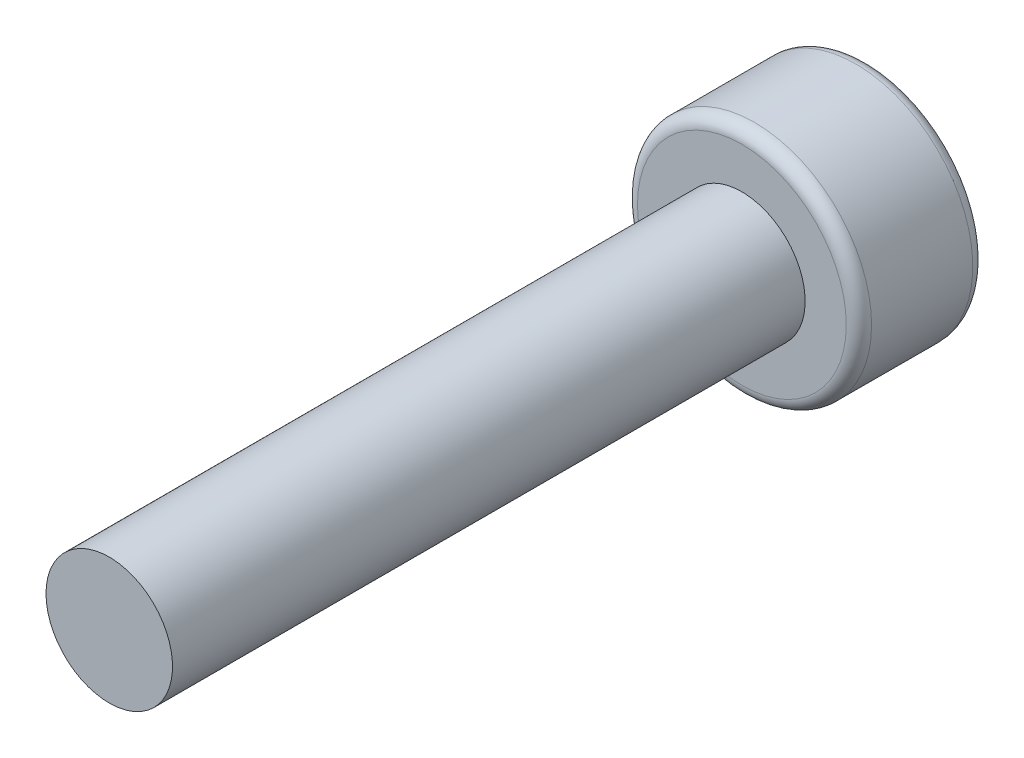
ISO-10303-21;
HEADER;
FILE_DESCRIPTION(('STEP AP214'),'2;1');
FILE_NAME('part.step','',(''),(''),'','','');
FILE_SCHEMA(('AUTOMOTIVE_DESIGN { 1 0 10303 214 1 1 1 1 }'));
ENDSEC;
DATA;
#1=APPLICATION_CONTEXT('core data for automotive mechanical design processes');
#2=APPLICATION_PROTOCOL_DEFINITION('international standard','automotive_design',2000,#1);
#3=PRODUCT_CONTEXT('',#1,'mechanical');
#4=PRODUCT('Part','Part','',(#3));
#5=PRODUCT_RELATED_PRODUCT_CATEGORY('part','',(#4));
#6=PRODUCT_DEFINITION_FORMATION('','',#4);
#7=PRODUCT_DEFINITION_CONTEXT('part definition',#1,'design');
#8=PRODUCT_DEFINITION('design','',#6,#7);
#9=PRODUCT_DEFINITION_SHAPE('','',#8);
#10=(LENGTH_UNIT() NAMED_UNIT(*) SI_UNIT(.MILLI.,.METRE.));
#11=(NAMED_UNIT(*) PLANE_ANGLE_UNIT() SI_UNIT($,.RADIAN.));
#12=(NAMED_UNIT(*) SI_UNIT($,.STERADIAN.) SOLID_ANGLE_UNIT());
#13=UNCERTAINTY_MEASURE_WITH_UNIT(LENGTH_MEASURE(1.E-05),#10,'distance_accuracy_value','');
#14=(GEOMETRIC_REPRESENTATION_CONTEXT(3) GLOBAL_UNCERTAINTY_ASSIGNED_CONTEXT((#13)) GLOBAL_UNIT_ASSIGNED_CONTEXT((#10,
#11,#12)) REPRESENTATION_CONTEXT('',''));
#15=CARTESIAN_POINT('',(0.,0.,0.));
#16=DIRECTION('',(0.,0.,1.));
#17=DIRECTION('',(1.,0.,0.));
#18=AXIS2_PLACEMENT_3D('',#15,#16,#17);
#19=CARTESIAN_POINT('',(0.,0.,1.));
#20=DIRECTION('',(0.,0.,-1.));
#21=DIRECTION('',(-1.,0.,0.));
#22=AXIS2_PLACEMENT_3D('',#19,#20,#21);
#23=PLANE('',#22);
#24=DIRECTION('',(0.698983626140259,-0.715137672331569,0.));
#25=VECTOR('',#24,1.);
#26=CARTESIAN_POINT('',(-0.380295932212079,-1.35708342933218,1.));
#27=LINE('',#26,#25);
#28=CARTESIAN_POINT('',(-0.380295932212079,-1.35708342933218,1.));
#29=VERTEX_POINT('',#28);
#30=CARTESIAN_POINT('',(-1.36541669096261,-0.349195776414544,1.));
#31=VERTEX_POINT('',#30);
#32=EDGE_CURVE('E104',#29,#31,#27,.F.);
#33=ORIENTED_EDGE('',*,*,#32,.T.);
#34=DIRECTION('',(-0.269835578372281,-0.962906413232614,0.));
#35=VECTOR('',#34,1.);
#36=CARTESIAN_POINT('',(-1.36541669096261,-0.349195776414544,1.));
#37=LINE('',#36,#35);
#38=CARTESIAN_POINT('',(-0.98512075875053,1.00788765291763,1.));
#39=VERTEX_POINT('',#38);
#40=EDGE_CURVE('E184',#31,#39,#37,.F.);
#41=ORIENTED_EDGE('',*,*,#40,.T.);
#42=DIRECTION('',(-0.96881920451254,-0.247768740901045,0.));
#43=VECTOR('',#42,1.);
#44=CARTESIAN_POINT('',(-0.98512075875053,1.00788765291763,1.));
#45=LINE('',#44,#43);
#46=CARTESIAN_POINT('',(0.380295932212079,1.35708342933218,1.));
#47=VERTEX_POINT('',#46);
#48=EDGE_CURVE('E179',#39,#47,#45,.F.);
#49=ORIENTED_EDGE('',*,*,#48,.T.);
#50=DIRECTION('',(-0.698983626140259,0.715137672331569,0.));
#51=VECTOR('',#50,1.);
#52=CARTESIAN_POINT('',(0.380295932212079,1.35708342933218,1.));
#53=LINE('',#52,#51);
#54=CARTESIAN_POINT('',(1.36541669096261,0.349195776414543,1.));
#55=VERTEX_POINT('',#54);
#56=EDGE_CURVE('E87',#47,#55,#53,.F.);
#57=ORIENTED_EDGE('',*,*,#56,.T.);
#58=DIRECTION('',(0.269835578372281,0.962906413232614,0.));
#59=VECTOR('',#58,1.);
#60=CARTESIAN_POINT('',(1.36541669096261,0.349195776414543,1.));
#61=LINE('',#60,#59);
#62=CARTESIAN_POINT('',(0.98512075875053,-1.00788765291763,1.));
#63=VERTEX_POINT('',#62);
#64=EDGE_CURVE('E84',#55,#63,#61,.F.);
#65=ORIENTED_EDGE('',*,*,#64,.T.);
#66=DIRECTION('',(0.96881920451254,0.247768740901045,0.));
#67=VECTOR('',#66,1.);
#68=CARTESIAN_POINT('',(0.98512075875053,-1.00788765291763,1.));
#69=LINE('',#68,#67);
#70=EDGE_CURVE('E81',#63,#29,#69,.F.);
#71=ORIENTED_EDGE('',*,*,#70,.T.);
#72=EDGE_LOOP('',(#33,#41,#49,#57,#65,#71));
#73=FACE_BOUND('',#72,.T.);
#74=ADVANCED_FACE('F17',(#73),#23,.T.);
#75=CARTESIAN_POINT('',(1.36541669096261,0.349195776414543,1.));
#76=DIRECTION('',(0.962906413232614,-0.269835578372281,0.));
#77=DIRECTION('',(0.269835578372281,0.962906413232614,0.));
#78=AXIS2_PLACEMENT_3D('',#75,#76,#77);
#79=PLANE('',#78);
#80=DIRECTION('',(0.,0.,1.));
#81=VECTOR('',#80,1.);
#82=CARTESIAN_POINT('',(0.98512075875053,-1.00788765291763,1.));
#83=LINE('',#82,#81);
#84=CARTESIAN_POINT('',(0.98512075875053,-1.00788765291763,0.));
#85=VERTEX_POINT('',#84);
#86=EDGE_CURVE('E90',#85,#63,#83,.T.);
#87=ORIENTED_EDGE('',*,*,#86,.T.);
#88=ORIENTED_EDGE('',*,*,#64,.F.);
#89=DIRECTION('',(0.,0.,1.));
#90=VECTOR('',#89,1.);
#91=CARTESIAN_POINT('',(1.36541669096261,0.349195776414543,1.));
#92=LINE('',#91,#90);
#93=CARTESIAN_POINT('',(1.36541669096261,0.349195776414543,0.));
#94=VERTEX_POINT('',#93);
#95=EDGE_CURVE('E168',#55,#94,#92,.F.);
#96=ORIENTED_EDGE('',*,*,#95,.T.);
#97=DIRECTION('',(-0.269835578372281,-0.962906413232614,0.));
#98=VECTOR('',#97,1.);
#99=CARTESIAN_POINT('',(1.36541669096261,0.349195776414543,0.));
#100=LINE('',#99,#98);
#101=EDGE_CURVE('E95',#94,#85,#100,.T.);
#102=ORIENTED_EDGE('',*,*,#101,.T.);
#103=EDGE_LOOP('',(#87,#88,#96,#102));
#104=FACE_BOUND('',#103,.T.);
#105=ADVANCED_FACE('F93',(#104),#79,.F.);
#106=CARTESIAN_POINT('',(0.98512075875053,-1.00788765291763,1.));
#107=DIRECTION('',(0.247768740901045,-0.96881920451254,0.));
#108=DIRECTION('',(0.96881920451254,0.247768740901045,0.));
#109=AXIS2_PLACEMENT_3D('',#106,#107,#108);
#110=PLANE('',#109);
#111=DIRECTION('',(0.,0.,1.));
#112=VECTOR('',#111,1.);
#113=CARTESIAN_POINT('',(-0.380295932212079,-1.35708342933218,1.));
#114=LINE('',#113,#112);
#115=CARTESIAN_POINT('',(-0.380295932212079,-1.35708342933218,0.));
#116=VERTEX_POINT('',#115);
#117=EDGE_CURVE('E101',#116,#29,#114,.T.);
#118=ORIENTED_EDGE('',*,*,#117,.T.);
#119=ORIENTED_EDGE('',*,*,#70,.F.);
#120=ORIENTED_EDGE('',*,*,#86,.F.);
#121=DIRECTION('',(-0.96881920451254,-0.247768740901045,0.));
#122=VECTOR('',#121,1.);
#123=CARTESIAN_POINT('',(0.98512075875053,-1.00788765291763,0.));
#124=LINE('',#123,#122);
#125=EDGE_CURVE('E213',#85,#116,#124,.T.);
#126=ORIENTED_EDGE('',*,*,#125,.T.);
#127=EDGE_LOOP('',(#118,#119,#120,#126));
#128=FACE_BOUND('',#127,.T.);
#129=ADVANCED_FACE('F99',(#128),#110,.F.);
#130=CARTESIAN_POINT('',(-0.380295932212079,-1.35708342933218,1.));
#131=DIRECTION('',(-0.715137672331569,-0.698983626140259,0.));
#132=DIRECTION('',(0.698983626140259,-0.715137672331569,0.));
#133=AXIS2_PLACEMENT_3D('',#130,#131,#132);
#134=PLANE('',#133);
#135=DIRECTION('',(0.,0.,1.));
#136=VECTOR('',#135,1.);
#137=CARTESIAN_POINT('',(-1.36541669096261,-0.349195776414544,1.));
#138=LINE('',#137,#136);
#139=CARTESIAN_POINT('',(-1.36541669096261,-0.349195776414544,0.));
#140=VERTEX_POINT('',#139);
#141=EDGE_CURVE('E186',#140,#31,#138,.T.);
#142=ORIENTED_EDGE('',*,*,#141,.T.);
#143=ORIENTED_EDGE('',*,*,#32,.F.);
#144=ORIENTED_EDGE('',*,*,#117,.F.);
#145=DIRECTION('',(-0.698983626140259,0.715137672331569,0.));
#146=VECTOR('',#145,1.);
#147=CARTESIAN_POINT('',(-0.380295932212079,-1.35708342933218,0.));
#148=LINE('',#147,#146);
#149=EDGE_CURVE('E193',#116,#140,#148,.T.);
#150=ORIENTED_EDGE('',*,*,#149,.T.);
#151=EDGE_LOOP('',(#142,#143,#144,#150));
#152=FACE_BOUND('',#151,.T.);
#153=ADVANCED_FACE('F191',(#152),#134,.F.);
#154=CARTESIAN_POINT('',(-1.36541669096261,-0.349195776414544,1.));
#155=DIRECTION('',(-0.962906413232614,0.269835578372281,0.));
#156=DIRECTION('',(-0.269835578372281,-0.962906413232614,0.));
#157=AXIS2_PLACEMENT_3D('',#154,#155,#156);
#158=PLANE('',#157);
#159=DIRECTION('',(0.,0.,1.));
#160=VECTOR('',#159,1.);
#161=CARTESIAN_POINT('',(-0.98512075875053,1.00788765291763,1.));
#162=LINE('',#161,#160);
#163=CARTESIAN_POINT('',(-0.98512075875053,1.00788765291763,0.));
#164=VERTEX_POINT('',#163);
#165=EDGE_CURVE('E181',#164,#39,#162,.T.);
#166=ORIENTED_EDGE('',*,*,#165,.T.);
#167=ORIENTED_EDGE('',*,*,#40,.F.);
#168=ORIENTED_EDGE('',*,*,#141,.F.);
#169=DIRECTION('',(0.26983557837228,0.962906413232614,0.));
#170=VECTOR('',#169,1.);
#171=CARTESIAN_POINT('',(-1.36541669096261,-0.349195776414544,0.));
#172=LINE('',#171,#170);
#173=EDGE_CURVE('E199',#140,#164,#172,.T.);
#174=ORIENTED_EDGE('',*,*,#173,.T.);
#175=EDGE_LOOP('',(#166,#167,#168,#174));
#176=FACE_BOUND('',#175,.T.);
#177=ADVANCED_FACE('F196',(#176),#158,.F.);
#178=CARTESIAN_POINT('',(-0.98512075875053,1.00788765291763,1.));
#179=DIRECTION('',(-0.247768740901045,0.96881920451254,0.));
#180=DIRECTION('',(-0.96881920451254,-0.247768740901045,0.));
#181=AXIS2_PLACEMENT_3D('',#178,#179,#180);
#182=PLANE('',#181);
#183=DIRECTION('',(0.,0.,1.));
#184=VECTOR('',#183,1.);
#185=CARTESIAN_POINT('',(0.380295932212079,1.35708342933218,1.));
#186=LINE('',#185,#184);
#187=CARTESIAN_POINT('',(0.380295932212079,1.35708342933218,0.));
#188=VERTEX_POINT('',#187);
#189=EDGE_CURVE('E176',#188,#47,#186,.T.);
#190=ORIENTED_EDGE('',*,*,#189,.T.);
#191=ORIENTED_EDGE('',*,*,#48,.F.);
#192=ORIENTED_EDGE('',*,*,#165,.F.);
#193=DIRECTION('',(0.96881920451254,0.247768740901045,0.));
#194=VECTOR('',#193,1.);
#195=CARTESIAN_POINT('',(-0.98512075875053,1.00788765291763,0.));
#196=LINE('',#195,#194);
#197=EDGE_CURVE('E204',#164,#188,#196,.T.);
#198=ORIENTED_EDGE('',*,*,#197,.T.);
#199=EDGE_LOOP('',(#190,#191,#192,#198));
#200=FACE_BOUND('',#199,.T.);
#201=ADVANCED_FACE('F202',(#200),#182,.F.);
#202=CARTESIAN_POINT('',(0.380295932212079,1.35708342933218,1.));
#203=DIRECTION('',(0.715137672331569,0.698983626140259,0.));
#204=DIRECTION('',(-0.698983626140259,0.715137672331569,0.));
#205=AXIS2_PLACEMENT_3D('',#202,#203,#204);
#206=PLANE('',#205);
#207=ORIENTED_EDGE('',*,*,#95,.F.);
#208=ORIENTED_EDGE('',*,*,#56,.F.);
#209=ORIENTED_EDGE('',*,*,#189,.F.);
#210=DIRECTION('',(0.698983626140259,-0.715137672331569,0.));
#211=VECTOR('',#210,1.);
#212=CARTESIAN_POINT('',(0.380295932212079,1.35708342933218,0.));
#213=LINE('',#212,#211);
#214=EDGE_CURVE('E209',#188,#94,#213,.T.);
#215=ORIENTED_EDGE('',*,*,#214,.T.);
#216=EDGE_LOOP('',(#207,#208,#209,#215));
#217=FACE_BOUND('',#216,.T.);
#218=ADVANCED_FACE('F208',(#217),#206,.F.);
#219=CARTESIAN_POINT('',(0.,0.,0.));
#220=DIRECTION('',(0.,0.,1.));
#221=DIRECTION('',(1.,0.,0.));
#222=AXIS2_PLACEMENT_3D('',#219,#220,#221);
#223=PLANE('',#222);
#224=CARTESIAN_POINT('',(0.,0.,0.));
#225=DIRECTION('',(0.,0.,1.));
#226=DIRECTION('',(1.,0.,0.));
#227=AXIS2_PLACEMENT_3D('',#224,#225,#226);
#228=CIRCLE('',#227,1.65);
#229=CARTESIAN_POINT('',(1.65,0.,0.));
#230=VERTEX_POINT('',#229);
#231=CARTESIAN_POINT('',(-1.65,0.,0.));
#232=VERTEX_POINT('',#231);
#233=EDGE_CURVE('E211',#230,#232,#228,.T.);
#234=ORIENTED_EDGE('',*,*,#233,.F.);
#235=CARTESIAN_POINT('',(0.,0.,0.));
#236=DIRECTION('',(0.,0.,1.));
#237=DIRECTION('',(-1.,0.,0.));
#238=AXIS2_PLACEMENT_3D('',#235,#236,#237);
#239=CIRCLE('',#238,1.65);
#240=EDGE_CURVE('E230',#232,#230,#239,.T.);
#241=ORIENTED_EDGE('',*,*,#240,.F.);
#242=EDGE_LOOP('',(#234,#241));
#243=FACE_BOUND('',#242,.T.);
#244=ORIENTED_EDGE('',*,*,#197,.F.);
#245=ORIENTED_EDGE('',*,*,#173,.F.);
#246=ORIENTED_EDGE('',*,*,#149,.F.);
#247=ORIENTED_EDGE('',*,*,#125,.F.);
#248=ORIENTED_EDGE('',*,*,#101,.F.);
#249=ORIENTED_EDGE('',*,*,#214,.F.);
#250=EDGE_LOOP('',(#244,#245,#246,#247,#248,#249));
#251=FACE_BOUND('',#250,.T.);
#252=ADVANCED_FACE('F156',(#243,#251),#223,.F.);
#253=CARTESIAN_POINT('',(0.,0.,0.2));
#254=DIRECTION('',(0.,0.,1.));
#255=DIRECTION('',(1.,0.,0.));
#256=AXIS2_PLACEMENT_3D('',#253,#254,#255);
#257=TOROIDAL_SURFACE('',#256,1.65,0.2);
#258=ORIENTED_EDGE('',*,*,#233,.T.);
#259=ORIENTED_EDGE('',*,*,#240,.T.);
#260=EDGE_LOOP('',(#258,#259));
#261=FACE_BOUND('',#260,.T.);
#262=CARTESIAN_POINT('',(0.,0.,0.2));
#263=DIRECTION('',(0.,0.,-1.));
#264=DIRECTION('',(-1.,0.,0.));
#265=AXIS2_PLACEMENT_3D('',#262,#263,#264);
#266=CIRCLE('',#265,1.85);
#267=CARTESIAN_POINT('',(-1.85,0.,0.2));
#268=VERTEX_POINT('',#267);
#269=EDGE_CURVE('E148',#268,#268,#266,.F.);
#270=ORIENTED_EDGE('',*,*,#269,.F.);
#271=EDGE_LOOP('',(#270));
#272=FACE_BOUND('',#271,.T.);
#273=ADVANCED_FACE('F152',(#261,#272),#257,.T.);
#274=CARTESIAN_POINT('',(0.,0.,2.));
#275=DIRECTION('',(0.,0.,-1.));
#276=DIRECTION('',(-1.,0.,0.));
#277=AXIS2_PLACEMENT_3D('',#274,#275,#276);
#278=CYLINDRICAL_SURFACE('',#277,1.85);
#279=CARTESIAN_POINT('',(0.,0.,1.8));
#280=DIRECTION('',(0.,0.,1.));
#281=DIRECTION('',(1.,0.,0.));
#282=AXIS2_PLACEMENT_3D('',#279,#280,#281);
#283=CIRCLE('',#282,1.85);
#284=CARTESIAN_POINT('',(1.85,0.,1.8));
#285=VERTEX_POINT('',#284);
#286=EDGE_CURVE('E140',#285,#285,#283,.T.);
#287=ORIENTED_EDGE('',*,*,#286,.F.);
#288=EDGE_LOOP('',(#287));
#289=FACE_BOUND('',#288,.T.);
#290=ORIENTED_EDGE('',*,*,#269,.T.);
#291=EDGE_LOOP('',(#290));
#292=FACE_BOUND('',#291,.T.);
#293=ADVANCED_FACE('F127',(#289,#292),#278,.T.);
#294=CARTESIAN_POINT('',(0.,0.,1.8));
#295=DIRECTION('',(0.,0.,1.));
#296=DIRECTION('',(1.,0.,0.));
#297=AXIS2_PLACEMENT_3D('',#294,#295,#296);
#298=TOROIDAL_SURFACE('',#297,1.65,0.2);
#299=ORIENTED_EDGE('',*,*,#286,.T.);
#300=EDGE_LOOP('',(#299));
#301=FACE_BOUND('',#300,.T.);
#302=CARTESIAN_POINT('',(0.,0.,2.));
#303=DIRECTION('',(0.,0.,-1.));
#304=DIRECTION('',(1.,0.,0.));
#305=AXIS2_PLACEMENT_3D('',#302,#303,#304);
#306=CIRCLE('',#305,1.65);
#307=CARTESIAN_POINT('',(-1.65,0.,2.));
#308=VERTEX_POINT('',#307);
#309=CARTESIAN_POINT('',(1.65,0.,2.));
#310=VERTEX_POINT('',#309);
#311=EDGE_CURVE('E36',#308,#310,#306,.F.);
#312=ORIENTED_EDGE('',*,*,#311,.F.);
#313=CARTESIAN_POINT('',(0.,0.,2.));
#314=DIRECTION('',(0.,0.,-1.));
#315=DIRECTION('',(-1.,0.,0.));
#316=AXIS2_PLACEMENT_3D('',#313,#314,#315);
#317=CIRCLE('',#316,1.65);
#318=EDGE_CURVE('E111',#310,#308,#317,.F.);
#319=ORIENTED_EDGE('',*,*,#318,.F.);
#320=EDGE_LOOP('',(#312,#319));
#321=FACE_BOUND('',#320,.T.);
#322=ADVANCED_FACE('F115',(#301,#321),#298,.T.);
#323=CARTESIAN_POINT('',(0.,0.,12.));
#324=DIRECTION('',(0.,0.,1.));
#325=DIRECTION('',(1.,0.,0.));
#326=AXIS2_PLACEMENT_3D('',#323,#324,#325);
#327=PLANE('',#326);
#328=CARTESIAN_POINT('',(0.,0.,12.));
#329=DIRECTION('',(0.,0.,-1.));
#330=DIRECTION('',(-1.,0.,0.));
#331=AXIS2_PLACEMENT_3D('',#328,#329,#330);
#332=CIRCLE('',#331,1.);
#333=CARTESIAN_POINT('',(-1.,0.,12.));
#334=VERTEX_POINT('',#333);
#335=EDGE_CURVE('E28',#334,#334,#332,.T.);
#336=ORIENTED_EDGE('',*,*,#335,.F.);
#337=EDGE_LOOP('',(#336));
#338=FACE_BOUND('',#337,.T.);
#339=ADVANCED_FACE('F126',(#338),#327,.T.);
#340=CARTESIAN_POINT('',(0.,0.,2.));
#341=DIRECTION('',(0.,0.,1.));
#342=DIRECTION('',(1.,0.,0.));
#343=AXIS2_PLACEMENT_3D('',#340,#341,#342);
#344=PLANE('',#343);
#345=CARTESIAN_POINT('',(0.,0.,2.));
#346=DIRECTION('',(0.,0.,-1.));
#347=DIRECTION('',(-1.,0.,0.));
#348=AXIS2_PLACEMENT_3D('',#345,#346,#347);
#349=CIRCLE('',#348,1.);
#350=CARTESIAN_POINT('',(-1.,0.,2.));
#351=VERTEX_POINT('',#350);
#352=EDGE_CURVE('E11',#351,#351,#349,.F.);
#353=ORIENTED_EDGE('',*,*,#352,.F.);
#354=EDGE_LOOP('',(#353));
#355=FACE_BOUND('',#354,.T.);
#356=ORIENTED_EDGE('',*,*,#318,.T.);
#357=ORIENTED_EDGE('',*,*,#311,.T.);
#358=EDGE_LOOP('',(#356,#357));
#359=FACE_BOUND('',#358,.T.);
#360=ADVANCED_FACE('F250',(#355,#359),#344,.T.);
#361=CARTESIAN_POINT('',(0.,0.,12.));
#362=DIRECTION('',(0.,0.,-1.));
#363=DIRECTION('',(-1.,0.,0.));
#364=AXIS2_PLACEMENT_3D('',#361,#362,#363);
#365=CYLINDRICAL_SURFACE('',#364,1.);
#366=ORIENTED_EDGE('',*,*,#352,.T.);
#367=EDGE_LOOP('',(#366));
#368=FACE_BOUND('',#367,.T.);
#369=ORIENTED_EDGE('',*,*,#335,.T.);
#370=EDGE_LOOP('',(#369));
#371=FACE_BOUND('',#370,.T.);
#372=ADVANCED_FACE('F248',(#368,#371),#365,.T.);
#373=CLOSED_SHELL('',(#74,#105,#129,#153,#177,#201,#218,#252,#273,#293,#322,#339,#360,#372));
#374=MANIFOLD_SOLID_BREP('B1',#373);
#375=ADVANCED_BREP_SHAPE_REPRESENTATION('',(#18,#374),#14);
#376=SHAPE_DEFINITION_REPRESENTATION(#9,#375);
ENDSEC;
END-ISO-10303-21;
